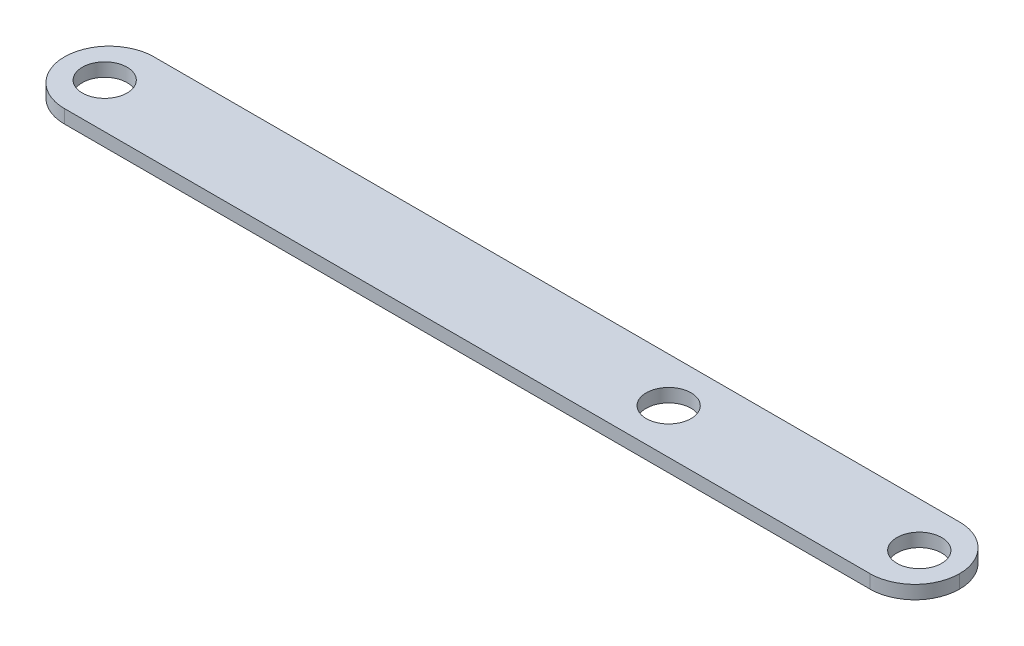
ISO-10303-21;
HEADER;
FILE_DESCRIPTION(('STEP AP214'),'2;1');
FILE_NAME('part.step','',(''),(''),'','','');
FILE_SCHEMA(('AUTOMOTIVE_DESIGN { 1 0 10303 214 1 1 1 1 }'));
ENDSEC;
DATA;
#1=APPLICATION_CONTEXT('core data for automotive mechanical design processes');
#2=APPLICATION_PROTOCOL_DEFINITION('international standard','automotive_design',2000,#1);
#3=PRODUCT_CONTEXT('',#1,'mechanical');
#4=PRODUCT('Part','Part','',(#3));
#5=PRODUCT_RELATED_PRODUCT_CATEGORY('part','',(#4));
#6=PRODUCT_DEFINITION_FORMATION('','',#4);
#7=PRODUCT_DEFINITION_CONTEXT('part definition',#1,'design');
#8=PRODUCT_DEFINITION('design','',#6,#7);
#9=PRODUCT_DEFINITION_SHAPE('','',#8);
#10=(LENGTH_UNIT() NAMED_UNIT(*) SI_UNIT(.MILLI.,.METRE.));
#11=(NAMED_UNIT(*) PLANE_ANGLE_UNIT() SI_UNIT($,.RADIAN.));
#12=(NAMED_UNIT(*) SI_UNIT($,.STERADIAN.) SOLID_ANGLE_UNIT());
#13=UNCERTAINTY_MEASURE_WITH_UNIT(LENGTH_MEASURE(1.E-05),#10,'distance_accuracy_value','');
#14=(GEOMETRIC_REPRESENTATION_CONTEXT(3) GLOBAL_UNCERTAINTY_ASSIGNED_CONTEXT((#13)) GLOBAL_UNIT_ASSIGNED_CONTEXT((#10,
#11,#12)) REPRESENTATION_CONTEXT('',''));
#15=CARTESIAN_POINT('',(0.,0.,0.));
#16=DIRECTION('',(0.,0.,1.));
#17=DIRECTION('',(1.,0.,0.));
#18=AXIS2_PLACEMENT_3D('',#15,#16,#17);
#19=CARTESIAN_POINT('',(0.,3.,0.));
#20=DIRECTION('',(0.,0.,-1.));
#21=DIRECTION('',(-1.,0.,0.));
#22=AXIS2_PLACEMENT_3D('',#19,#20,#21);
#23=PLANE('',#22);
#24=DIRECTION('',(1.,0.,0.));
#25=VECTOR('',#24,1.);
#26=CARTESIAN_POINT('',(0.,0.,0.));
#27=LINE('',#26,#25);
#28=CARTESIAN_POINT('',(10.,0.,0.));
#29=VERTEX_POINT('',#28);
#30=CARTESIAN_POINT('',(190.,0.,0.));
#31=VERTEX_POINT('',#30);
#32=EDGE_CURVE('E99',#29,#31,#27,.T.);
#33=ORIENTED_EDGE('',*,*,#32,.T.);
#34=DIRECTION('',(0.,-1.,0.));
#35=VECTOR('',#34,1.);
#36=CARTESIAN_POINT('',(190.,3.,0.));
#37=LINE('',#36,#35);
#38=CARTESIAN_POINT('',(190.,3.,0.));
#39=VERTEX_POINT('',#38);
#40=EDGE_CURVE('E11',#31,#39,#37,.F.);
#41=ORIENTED_EDGE('',*,*,#40,.T.);
#42=DIRECTION('',(1.,0.,0.));
#43=VECTOR('',#42,1.);
#44=CARTESIAN_POINT('',(0.,3.,0.));
#45=LINE('',#44,#43);
#46=CARTESIAN_POINT('',(10.,3.,0.));
#47=VERTEX_POINT('',#46);
#48=EDGE_CURVE('E141',#47,#39,#45,.T.);
#49=ORIENTED_EDGE('',*,*,#48,.F.);
#50=DIRECTION('',(0.,-1.,0.));
#51=VECTOR('',#50,1.);
#52=CARTESIAN_POINT('',(10.,3.,0.));
#53=LINE('',#52,#51);
#54=EDGE_CURVE('E123',#47,#29,#53,.T.);
#55=ORIENTED_EDGE('',*,*,#54,.T.);
#56=EDGE_LOOP('',(#33,#41,#49,#55));
#57=FACE_BOUND('',#56,.T.);
#58=ADVANCED_FACE('F37',(#57),#23,.F.);
#59=CARTESIAN_POINT('',(0.,3.,-20.));
#60=DIRECTION('',(0.,0.,1.));
#61=DIRECTION('',(1.,0.,0.));
#62=AXIS2_PLACEMENT_3D('',#59,#60,#61);
#63=PLANE('',#62);
#64=DIRECTION('',(-1.,0.,0.));
#65=VECTOR('',#64,1.);
#66=CARTESIAN_POINT('',(0.,3.,-20.));
#67=LINE('',#66,#65);
#68=CARTESIAN_POINT('',(190.,3.,-20.));
#69=VERTEX_POINT('',#68);
#70=CARTESIAN_POINT('',(10.,3.,-20.));
#71=VERTEX_POINT('',#70);
#72=EDGE_CURVE('E102',#69,#71,#67,.T.);
#73=ORIENTED_EDGE('',*,*,#72,.F.);
#74=DIRECTION('',(0.,-1.,0.));
#75=VECTOR('',#74,1.);
#76=CARTESIAN_POINT('',(190.,3.,-20.));
#77=LINE('',#76,#75);
#78=CARTESIAN_POINT('',(190.,0.,-20.));
#79=VERTEX_POINT('',#78);
#80=EDGE_CURVE('E124',#69,#79,#77,.T.);
#81=ORIENTED_EDGE('',*,*,#80,.T.);
#82=DIRECTION('',(-1.,0.,0.));
#83=VECTOR('',#82,1.);
#84=CARTESIAN_POINT('',(0.,0.,-20.));
#85=LINE('',#84,#83);
#86=CARTESIAN_POINT('',(10.,0.,-20.));
#87=VERTEX_POINT('',#86);
#88=EDGE_CURVE('E145',#79,#87,#85,.T.);
#89=ORIENTED_EDGE('',*,*,#88,.T.);
#90=DIRECTION('',(0.,-1.,0.));
#91=VECTOR('',#90,1.);
#92=CARTESIAN_POINT('',(10.,3.,-20.));
#93=LINE('',#92,#91);
#94=EDGE_CURVE('E115',#87,#71,#93,.F.);
#95=ORIENTED_EDGE('',*,*,#94,.T.);
#96=EDGE_LOOP('',(#73,#81,#89,#95));
#97=FACE_BOUND('',#96,.T.);
#98=ADVANCED_FACE('F140',(#97),#63,.F.);
#99=CARTESIAN_POINT('',(0.,3.,0.));
#100=DIRECTION('',(0.,-1.,0.));
#101=DIRECTION('',(0.,0.,-1.));
#102=AXIS2_PLACEMENT_3D('',#99,#100,#101);
#103=PLANE('',#102);
#104=CARTESIAN_POINT('',(135.,3.,-10.));
#105=DIRECTION('',(0.,1.,0.));
#106=DIRECTION('',(0.,0.,1.));
#107=AXIS2_PLACEMENT_3D('',#104,#105,#106);
#108=CIRCLE('',#107,4.99999999999999);
#109=CARTESIAN_POINT('',(135.,3.,-5.00000000000002));
#110=VERTEX_POINT('',#109);
#111=EDGE_CURVE('E149',#110,#110,#108,.T.);
#112=ORIENTED_EDGE('',*,*,#111,.F.);
#113=EDGE_LOOP('',(#112));
#114=FACE_BOUND('',#113,.T.);
#115=CARTESIAN_POINT('',(191.,3.,-10.));
#116=DIRECTION('',(0.,1.,0.));
#117=DIRECTION('',(0.,0.,1.));
#118=AXIS2_PLACEMENT_3D('',#115,#116,#117);
#119=CIRCLE('',#118,4.99999999999999);
#120=CARTESIAN_POINT('',(191.,3.,-5.00000000000001));
#121=VERTEX_POINT('',#120);
#122=EDGE_CURVE('E111',#121,#121,#119,.T.);
#123=ORIENTED_EDGE('',*,*,#122,.F.);
#124=EDGE_LOOP('',(#123));
#125=FACE_BOUND('',#124,.T.);
#126=CARTESIAN_POINT('',(9.,3.,-10.));
#127=DIRECTION('',(0.,1.,0.));
#128=DIRECTION('',(0.,0.,1.));
#129=AXIS2_PLACEMENT_3D('',#126,#127,#128);
#130=CIRCLE('',#129,5.);
#131=CARTESIAN_POINT('',(9.,3.,-5.));
#132=VERTEX_POINT('',#131);
#133=EDGE_CURVE('E159',#132,#132,#130,.T.);
#134=ORIENTED_EDGE('',*,*,#133,.F.);
#135=EDGE_LOOP('',(#134));
#136=FACE_BOUND('',#135,.T.);
#137=CARTESIAN_POINT('',(190.,3.,-10.));
#138=DIRECTION('',(0.,-1.,0.));
#139=DIRECTION('',(0.,0.,-1.));
#140=AXIS2_PLACEMENT_3D('',#137,#138,#139);
#141=CIRCLE('',#140,10.);
#142=CARTESIAN_POINT('',(200.,3.,-10.));
#143=VERTEX_POINT('',#142);
#144=EDGE_CURVE('E53',#39,#143,#141,.F.);
#145=ORIENTED_EDGE('',*,*,#144,.T.);
#146=CARTESIAN_POINT('',(190.,3.,-10.));
#147=DIRECTION('',(0.,-1.,0.));
#148=DIRECTION('',(0.,0.,-1.));
#149=AXIS2_PLACEMENT_3D('',#146,#147,#148);
#150=CIRCLE('',#149,10.);
#151=EDGE_CURVE('E46',#143,#69,#150,.F.);
#152=ORIENTED_EDGE('',*,*,#151,.T.);
#153=ORIENTED_EDGE('',*,*,#72,.T.);
#154=CARTESIAN_POINT('',(10.,3.,-10.));
#155=DIRECTION('',(0.,-1.,0.));
#156=DIRECTION('',(0.,0.,-1.));
#157=AXIS2_PLACEMENT_3D('',#154,#155,#156);
#158=CIRCLE('',#157,10.);
#159=CARTESIAN_POINT('',(0.,3.,-10.));
#160=VERTEX_POINT('',#159);
#161=EDGE_CURVE('E121',#71,#160,#158,.F.);
#162=ORIENTED_EDGE('',*,*,#161,.T.);
#163=CARTESIAN_POINT('',(10.,3.,-10.));
#164=DIRECTION('',(0.,-1.,0.));
#165=DIRECTION('',(0.,0.,-1.));
#166=AXIS2_PLACEMENT_3D('',#163,#164,#165);
#167=CIRCLE('',#166,10.);
#168=EDGE_CURVE('E108',#160,#47,#167,.F.);
#169=ORIENTED_EDGE('',*,*,#168,.T.);
#170=ORIENTED_EDGE('',*,*,#48,.T.);
#171=EDGE_LOOP('',(#145,#152,#153,#162,#169,#170));
#172=FACE_BOUND('',#171,.T.);
#173=ADVANCED_FACE('F135',(#114,#125,#136,#172),#103,.F.);
#174=CARTESIAN_POINT('',(0.,0.,0.));
#175=DIRECTION('',(0.,-1.,0.));
#176=DIRECTION('',(0.,0.,-1.));
#177=AXIS2_PLACEMENT_3D('',#174,#175,#176);
#178=PLANE('',#177);
#179=CARTESIAN_POINT('',(135.,0.,-10.));
#180=DIRECTION('',(0.,1.,0.));
#181=DIRECTION('',(0.,0.,1.));
#182=AXIS2_PLACEMENT_3D('',#179,#180,#181);
#183=CIRCLE('',#182,4.99999999999999);
#184=CARTESIAN_POINT('',(135.,0.,-5.00000000000002));
#185=VERTEX_POINT('',#184);
#186=EDGE_CURVE('E147',#185,#185,#183,.T.);
#187=ORIENTED_EDGE('',*,*,#186,.T.);
#188=EDGE_LOOP('',(#187));
#189=FACE_BOUND('',#188,.T.);
#190=CARTESIAN_POINT('',(191.,0.,-10.));
#191=DIRECTION('',(0.,1.,0.));
#192=DIRECTION('',(0.,0.,1.));
#193=AXIS2_PLACEMENT_3D('',#190,#191,#192);
#194=CIRCLE('',#193,4.99999999999999);
#195=CARTESIAN_POINT('',(191.,0.,-5.00000000000001));
#196=VERTEX_POINT('',#195);
#197=EDGE_CURVE('E156',#196,#196,#194,.T.);
#198=ORIENTED_EDGE('',*,*,#197,.T.);
#199=EDGE_LOOP('',(#198));
#200=FACE_BOUND('',#199,.T.);
#201=CARTESIAN_POINT('',(9.,0.,-10.));
#202=DIRECTION('',(0.,1.,0.));
#203=DIRECTION('',(0.,0.,1.));
#204=AXIS2_PLACEMENT_3D('',#201,#202,#203);
#205=CIRCLE('',#204,5.);
#206=CARTESIAN_POINT('',(9.,0.,-5.));
#207=VERTEX_POINT('',#206);
#208=EDGE_CURVE('E162',#207,#207,#205,.T.);
#209=ORIENTED_EDGE('',*,*,#208,.T.);
#210=EDGE_LOOP('',(#209));
#211=FACE_BOUND('',#210,.T.);
#212=ORIENTED_EDGE('',*,*,#88,.F.);
#213=CARTESIAN_POINT('',(190.,0.,-10.));
#214=DIRECTION('',(0.,-1.,0.));
#215=DIRECTION('',(0.,0.,-1.));
#216=AXIS2_PLACEMENT_3D('',#213,#214,#215);
#217=CIRCLE('',#216,10.);
#218=CARTESIAN_POINT('',(200.,0.,-10.));
#219=VERTEX_POINT('',#218);
#220=EDGE_CURVE('E130',#79,#219,#217,.T.);
#221=ORIENTED_EDGE('',*,*,#220,.T.);
#222=CARTESIAN_POINT('',(190.,0.,-10.));
#223=DIRECTION('',(0.,-1.,0.));
#224=DIRECTION('',(0.,0.,-1.));
#225=AXIS2_PLACEMENT_3D('',#222,#223,#224);
#226=CIRCLE('',#225,10.);
#227=EDGE_CURVE('E128',#219,#31,#226,.T.);
#228=ORIENTED_EDGE('',*,*,#227,.T.);
#229=ORIENTED_EDGE('',*,*,#32,.F.);
#230=CARTESIAN_POINT('',(10.,0.,-10.));
#231=DIRECTION('',(0.,-1.,0.));
#232=DIRECTION('',(0.,0.,-1.));
#233=AXIS2_PLACEMENT_3D('',#230,#231,#232);
#234=CIRCLE('',#233,10.);
#235=CARTESIAN_POINT('',(0.,0.,-10.));
#236=VERTEX_POINT('',#235);
#237=EDGE_CURVE('E92',#29,#236,#234,.T.);
#238=ORIENTED_EDGE('',*,*,#237,.T.);
#239=CARTESIAN_POINT('',(10.,0.,-10.));
#240=DIRECTION('',(0.,-1.,0.));
#241=DIRECTION('',(0.,0.,-1.));
#242=AXIS2_PLACEMENT_3D('',#239,#240,#241);
#243=CIRCLE('',#242,10.);
#244=EDGE_CURVE('E97',#236,#87,#243,.T.);
#245=ORIENTED_EDGE('',*,*,#244,.T.);
#246=EDGE_LOOP('',(#212,#221,#228,#229,#238,#245));
#247=FACE_BOUND('',#246,.T.);
#248=ADVANCED_FACE('F95',(#189,#200,#211,#247),#178,.T.);
#249=CARTESIAN_POINT('',(9.,0.,-10.));
#250=DIRECTION('',(0.,1.,0.));
#251=DIRECTION('',(0.,0.,1.));
#252=AXIS2_PLACEMENT_3D('',#249,#250,#251);
#253=CYLINDRICAL_SURFACE('',#252,5.);
#254=ORIENTED_EDGE('',*,*,#208,.F.);
#255=EDGE_LOOP('',(#254));
#256=FACE_BOUND('',#255,.T.);
#257=ORIENTED_EDGE('',*,*,#133,.T.);
#258=EDGE_LOOP('',(#257));
#259=FACE_BOUND('',#258,.T.);
#260=ADVANCED_FACE('F205',(#256,#259),#253,.F.);
#261=CARTESIAN_POINT('',(191.,0.,-10.));
#262=DIRECTION('',(0.,1.,0.));
#263=DIRECTION('',(0.,0.,1.));
#264=AXIS2_PLACEMENT_3D('',#261,#262,#263);
#265=CYLINDRICAL_SURFACE('',#264,4.99999999999999);
#266=ORIENTED_EDGE('',*,*,#197,.F.);
#267=EDGE_LOOP('',(#266));
#268=FACE_BOUND('',#267,.T.);
#269=ORIENTED_EDGE('',*,*,#122,.T.);
#270=EDGE_LOOP('',(#269));
#271=FACE_BOUND('',#270,.T.);
#272=ADVANCED_FACE('F179',(#268,#271),#265,.F.);
#273=CARTESIAN_POINT('',(10.,3.,-10.));
#274=DIRECTION('',(0.,-1.,0.));
#275=DIRECTION('',(0.,0.,-1.));
#276=AXIS2_PLACEMENT_3D('',#273,#274,#275);
#277=CYLINDRICAL_SURFACE('',#276,10.);
#278=ORIENTED_EDGE('',*,*,#54,.F.);
#279=ORIENTED_EDGE('',*,*,#168,.F.);
#280=DIRECTION('',(0.,-1.,0.));
#281=VECTOR('',#280,1.);
#282=CARTESIAN_POINT('',(0.,3.,-10.));
#283=LINE('',#282,#281);
#284=EDGE_CURVE('E106',#236,#160,#283,.F.);
#285=ORIENTED_EDGE('',*,*,#284,.F.);
#286=ORIENTED_EDGE('',*,*,#237,.F.);
#287=EDGE_LOOP('',(#278,#279,#285,#286));
#288=FACE_BOUND('',#287,.T.);
#289=ADVANCED_FACE('F107',(#288),#277,.T.);
#290=CARTESIAN_POINT('',(10.,3.,-10.));
#291=DIRECTION('',(0.,-1.,0.));
#292=DIRECTION('',(0.,0.,-1.));
#293=AXIS2_PLACEMENT_3D('',#290,#291,#292);
#294=CYLINDRICAL_SURFACE('',#293,10.);
#295=ORIENTED_EDGE('',*,*,#161,.F.);
#296=ORIENTED_EDGE('',*,*,#94,.F.);
#297=ORIENTED_EDGE('',*,*,#244,.F.);
#298=ORIENTED_EDGE('',*,*,#284,.T.);
#299=EDGE_LOOP('',(#295,#296,#297,#298));
#300=FACE_BOUND('',#299,.T.);
#301=ADVANCED_FACE('F113',(#300),#294,.T.);
#302=CARTESIAN_POINT('',(190.,3.,-10.));
#303=DIRECTION('',(0.,-1.,0.));
#304=DIRECTION('',(0.,0.,-1.));
#305=AXIS2_PLACEMENT_3D('',#302,#303,#304);
#306=CYLINDRICAL_SURFACE('',#305,10.);
#307=DIRECTION('',(0.,-1.,0.));
#308=VECTOR('',#307,1.);
#309=CARTESIAN_POINT('',(200.,3.,-10.));
#310=LINE('',#309,#308);
#311=EDGE_CURVE('E41',#143,#219,#310,.T.);
#312=ORIENTED_EDGE('',*,*,#311,.F.);
#313=ORIENTED_EDGE('',*,*,#144,.F.);
#314=ORIENTED_EDGE('',*,*,#40,.F.);
#315=ORIENTED_EDGE('',*,*,#227,.F.);
#316=EDGE_LOOP('',(#312,#313,#314,#315));
#317=FACE_BOUND('',#316,.T.);
#318=ADVANCED_FACE('F39',(#317),#306,.T.);
#319=CARTESIAN_POINT('',(190.,3.,-10.));
#320=DIRECTION('',(0.,-1.,0.));
#321=DIRECTION('',(0.,0.,-1.));
#322=AXIS2_PLACEMENT_3D('',#319,#320,#321);
#323=CYLINDRICAL_SURFACE('',#322,10.);
#324=ORIENTED_EDGE('',*,*,#151,.F.);
#325=ORIENTED_EDGE('',*,*,#311,.T.);
#326=ORIENTED_EDGE('',*,*,#220,.F.);
#327=ORIENTED_EDGE('',*,*,#80,.F.);
#328=EDGE_LOOP('',(#324,#325,#326,#327));
#329=FACE_BOUND('',#328,.T.);
#330=ADVANCED_FACE('F143',(#329),#323,.T.);
#331=CARTESIAN_POINT('',(135.,0.,-10.));
#332=DIRECTION('',(0.,1.,0.));
#333=DIRECTION('',(0.,0.,1.));
#334=AXIS2_PLACEMENT_3D('',#331,#332,#333);
#335=CYLINDRICAL_SURFACE('',#334,4.99999999999999);
#336=ORIENTED_EDGE('',*,*,#186,.F.);
#337=EDGE_LOOP('',(#336));
#338=FACE_BOUND('',#337,.T.);
#339=ORIENTED_EDGE('',*,*,#111,.T.);
#340=EDGE_LOOP('',(#339));
#341=FACE_BOUND('',#340,.T.);
#342=ADVANCED_FACE('F181',(#338,#341),#335,.F.);
#343=CLOSED_SHELL('',(#58,#98,#173,#248,#260,#272,#289,#301,#318,#330,#342));
#344=MANIFOLD_SOLID_BREP('B2',#343);
#345=ADVANCED_BREP_SHAPE_REPRESENTATION('',(#18,#344),#14);
#346=SHAPE_DEFINITION_REPRESENTATION(#9,#345);
ENDSEC;
END-ISO-10303-21;
